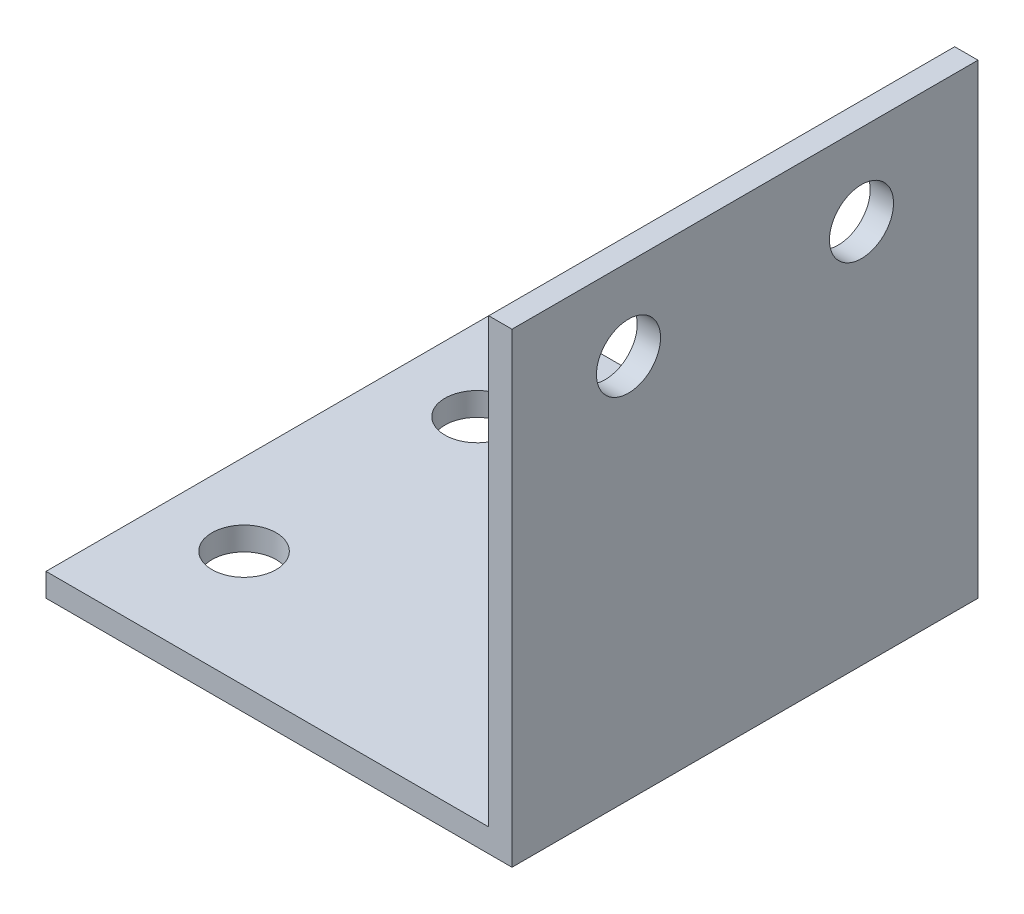
ISO-10303-21;
HEADER;
FILE_DESCRIPTION(('STEP AP214'),'2;1');
FILE_NAME('part.step','',(''),(''),'','','');
FILE_SCHEMA(('AUTOMOTIVE_DESIGN { 1 0 10303 214 1 1 1 1 }'));
ENDSEC;
DATA;
#1=APPLICATION_CONTEXT('core data for automotive mechanical design processes');
#2=APPLICATION_PROTOCOL_DEFINITION('international standard','automotive_design',2000,#1);
#3=PRODUCT_CONTEXT('',#1,'mechanical');
#4=PRODUCT('Part','Part','',(#3));
#5=PRODUCT_RELATED_PRODUCT_CATEGORY('part','',(#4));
#6=PRODUCT_DEFINITION_FORMATION('','',#4);
#7=PRODUCT_DEFINITION_CONTEXT('part definition',#1,'design');
#8=PRODUCT_DEFINITION('design','',#6,#7);
#9=PRODUCT_DEFINITION_SHAPE('','',#8);
#10=(LENGTH_UNIT() NAMED_UNIT(*) SI_UNIT(.MILLI.,.METRE.));
#11=(NAMED_UNIT(*) PLANE_ANGLE_UNIT() SI_UNIT($,.RADIAN.));
#12=(NAMED_UNIT(*) SI_UNIT($,.STERADIAN.) SOLID_ANGLE_UNIT());
#13=UNCERTAINTY_MEASURE_WITH_UNIT(LENGTH_MEASURE(1.E-05),#10,'distance_accuracy_value','');
#14=(GEOMETRIC_REPRESENTATION_CONTEXT(3) GLOBAL_UNCERTAINTY_ASSIGNED_CONTEXT((#13)) GLOBAL_UNIT_ASSIGNED_CONTEXT((#10,
#11,#12)) REPRESENTATION_CONTEXT('',''));
#15=CARTESIAN_POINT('',(0.,0.,0.));
#16=DIRECTION('',(0.,0.,1.));
#17=DIRECTION('',(1.,0.,0.));
#18=AXIS2_PLACEMENT_3D('',#15,#16,#17);
#19=CARTESIAN_POINT('',(38.,0.,40.));
#20=DIRECTION('',(0.,-1.,0.));
#21=DIRECTION('',(1.,0.,0.));
#22=AXIS2_PLACEMENT_3D('',#19,#20,#21);
#23=PLANE('',#22);
#24=CARTESIAN_POINT('',(7.00000000000002,0.,30.));
#25=DIRECTION('',(0.,-1.,0.));
#26=DIRECTION('',(1.,0.,0.));
#27=AXIS2_PLACEMENT_3D('',#24,#25,#26);
#28=CIRCLE('',#27,2.75);
#29=CARTESIAN_POINT('',(9.75000000000002,0.,30.));
#30=VERTEX_POINT('',#29);
#31=EDGE_CURVE('E148',#30,#30,#28,.F.);
#32=ORIENTED_EDGE('',*,*,#31,.F.);
#33=EDGE_LOOP('',(#32));
#34=FACE_BOUND('',#33,.T.);
#35=CARTESIAN_POINT('',(7.00000000000002,0.,10.));
#36=DIRECTION('',(0.,-1.,0.));
#37=DIRECTION('',(1.,0.,0.));
#38=AXIS2_PLACEMENT_3D('',#35,#36,#37);
#39=CIRCLE('',#38,2.75);
#40=CARTESIAN_POINT('',(9.75000000000002,0.,10.));
#41=VERTEX_POINT('',#40);
#42=EDGE_CURVE('E185',#41,#41,#39,.F.);
#43=ORIENTED_EDGE('',*,*,#42,.F.);
#44=EDGE_LOOP('',(#43));
#45=FACE_BOUND('',#44,.T.);
#46=DIRECTION('',(-1.,0.,0.));
#47=VECTOR('',#46,1.);
#48=CARTESIAN_POINT('',(38.,0.,0.));
#49=LINE('',#48,#47);
#50=CARTESIAN_POINT('',(38.,0.,0.));
#51=VERTEX_POINT('',#50);
#52=CARTESIAN_POINT('',(0.,0.,0.));
#53=VERTEX_POINT('',#52);
#54=EDGE_CURVE('E121',#51,#53,#49,.T.);
#55=ORIENTED_EDGE('',*,*,#54,.T.);
#56=DIRECTION('',(0.,0.,-1.));
#57=VECTOR('',#56,1.);
#58=CARTESIAN_POINT('',(0.,0.,40.));
#59=LINE('',#58,#57);
#60=CARTESIAN_POINT('',(0.,0.,40.));
#61=VERTEX_POINT('',#60);
#62=EDGE_CURVE('E11',#61,#53,#59,.T.);
#63=ORIENTED_EDGE('',*,*,#62,.F.);
#64=DIRECTION('',(-1.,0.,0.));
#65=VECTOR('',#64,1.);
#66=CARTESIAN_POINT('',(38.,0.,40.));
#67=LINE('',#66,#65);
#68=CARTESIAN_POINT('',(38.,0.,40.));
#69=VERTEX_POINT('',#68);
#70=EDGE_CURVE('E131',#69,#61,#67,.T.);
#71=ORIENTED_EDGE('',*,*,#70,.F.);
#72=DIRECTION('',(0.,0.,-1.));
#73=VECTOR('',#72,1.);
#74=CARTESIAN_POINT('',(38.,0.,40.));
#75=LINE('',#74,#73);
#76=EDGE_CURVE('E117',#69,#51,#75,.T.);
#77=ORIENTED_EDGE('',*,*,#76,.T.);
#78=EDGE_LOOP('',(#55,#63,#71,#77));
#79=FACE_BOUND('',#78,.T.);
#80=ADVANCED_FACE('F35',(#34,#45,#79),#23,.F.);
#81=CARTESIAN_POINT('',(0.,0.,40.));
#82=DIRECTION('',(1.,0.,0.));
#83=DIRECTION('',(0.,1.,0.));
#84=AXIS2_PLACEMENT_3D('',#81,#82,#83);
#85=PLANE('',#84);
#86=DIRECTION('',(0.,-1.,0.));
#87=VECTOR('',#86,1.);
#88=CARTESIAN_POINT('',(0.,0.,0.));
#89=LINE('',#88,#87);
#90=CARTESIAN_POINT('',(0.,-2.,0.));
#91=VERTEX_POINT('',#90);
#92=EDGE_CURVE('E124',#53,#91,#89,.T.);
#93=ORIENTED_EDGE('',*,*,#92,.T.);
#94=DIRECTION('',(0.,0.,-1.));
#95=VECTOR('',#94,1.);
#96=CARTESIAN_POINT('',(0.,-2.,40.));
#97=LINE('',#96,#95);
#98=CARTESIAN_POINT('',(0.,-2.,40.));
#99=VERTEX_POINT('',#98);
#100=EDGE_CURVE('E44',#99,#91,#97,.T.);
#101=ORIENTED_EDGE('',*,*,#100,.F.);
#102=DIRECTION('',(0.,-1.,0.));
#103=VECTOR('',#102,1.);
#104=CARTESIAN_POINT('',(0.,0.,40.));
#105=LINE('',#104,#103);
#106=EDGE_CURVE('E90',#61,#99,#105,.T.);
#107=ORIENTED_EDGE('',*,*,#106,.F.);
#108=ORIENTED_EDGE('',*,*,#62,.T.);
#109=EDGE_LOOP('',(#93,#101,#107,#108));
#110=FACE_BOUND('',#109,.T.);
#111=ADVANCED_FACE('F156',(#110),#85,.F.);
#112=CARTESIAN_POINT('',(0.,-2.,40.));
#113=DIRECTION('',(0.,1.,0.));
#114=DIRECTION('',(0.,0.,1.));
#115=AXIS2_PLACEMENT_3D('',#112,#113,#114);
#116=PLANE('',#115);
#117=CARTESIAN_POINT('',(7.00000000000002,-1.99999999999987,30.));
#118=DIRECTION('',(0.,1.,0.));
#119=DIRECTION('',(0.,0.,-1.));
#120=AXIS2_PLACEMENT_3D('',#117,#118,#119);
#121=CIRCLE('',#120,2.75);
#122=CARTESIAN_POINT('',(7.00000000000002,-1.99999999999987,27.25));
#123=VERTEX_POINT('',#122);
#124=EDGE_CURVE('E187',#123,#123,#121,.T.);
#125=ORIENTED_EDGE('',*,*,#124,.T.);
#126=EDGE_LOOP('',(#125));
#127=FACE_BOUND('',#126,.T.);
#128=CARTESIAN_POINT('',(7.00000000000001,-1.99999999999987,10.));
#129=DIRECTION('',(0.,1.,0.));
#130=DIRECTION('',(0.,0.,1.));
#131=AXIS2_PLACEMENT_3D('',#128,#129,#130);
#132=CIRCLE('',#131,2.75);
#133=CARTESIAN_POINT('',(7.00000000000001,-1.99999999999987,12.75));
#134=VERTEX_POINT('',#133);
#135=EDGE_CURVE('E189',#134,#134,#132,.T.);
#136=ORIENTED_EDGE('',*,*,#135,.T.);
#137=EDGE_LOOP('',(#136));
#138=FACE_BOUND('',#137,.T.);
#139=DIRECTION('',(1.,0.,0.));
#140=VECTOR('',#139,1.);
#141=CARTESIAN_POINT('',(0.,-2.,0.));
#142=LINE('',#141,#140);
#143=CARTESIAN_POINT('',(40.,-2.,0.));
#144=VERTEX_POINT('',#143);
#145=EDGE_CURVE('E126',#91,#144,#142,.T.);
#146=ORIENTED_EDGE('',*,*,#145,.T.);
#147=DIRECTION('',(0.,0.,-1.));
#148=VECTOR('',#147,1.);
#149=CARTESIAN_POINT('',(40.,-2.,40.));
#150=LINE('',#149,#148);
#151=CARTESIAN_POINT('',(40.,-2.,40.));
#152=VERTEX_POINT('',#151);
#153=EDGE_CURVE('E112',#152,#144,#150,.T.);
#154=ORIENTED_EDGE('',*,*,#153,.F.);
#155=DIRECTION('',(1.,0.,0.));
#156=VECTOR('',#155,1.);
#157=CARTESIAN_POINT('',(0.,-2.,40.));
#158=LINE('',#157,#156);
#159=EDGE_CURVE('E103',#99,#152,#158,.T.);
#160=ORIENTED_EDGE('',*,*,#159,.F.);
#161=ORIENTED_EDGE('',*,*,#100,.T.);
#162=EDGE_LOOP('',(#146,#154,#160,#161));
#163=FACE_BOUND('',#162,.T.);
#164=ADVANCED_FACE('F159',(#127,#138,#163),#116,.F.);
#165=CARTESIAN_POINT('',(40.,-2.,40.));
#166=DIRECTION('',(-1.,0.,0.));
#167=DIRECTION('',(0.,0.,1.));
#168=AXIS2_PLACEMENT_3D('',#165,#166,#167);
#169=PLANE('',#168);
#170=CARTESIAN_POINT('',(40.,31.,30.));
#171=DIRECTION('',(1.,0.,0.));
#172=DIRECTION('',(0.,0.,-1.));
#173=AXIS2_PLACEMENT_3D('',#170,#171,#172);
#174=CIRCLE('',#173,2.75);
#175=CARTESIAN_POINT('',(40.,31.,27.25));
#176=VERTEX_POINT('',#175);
#177=EDGE_CURVE('E138',#176,#176,#174,.T.);
#178=ORIENTED_EDGE('',*,*,#177,.F.);
#179=EDGE_LOOP('',(#178));
#180=FACE_BOUND('',#179,.T.);
#181=CARTESIAN_POINT('',(40.,31.,10.));
#182=DIRECTION('',(1.,0.,0.));
#183=DIRECTION('',(0.,0.,1.));
#184=AXIS2_PLACEMENT_3D('',#181,#182,#183);
#185=CIRCLE('',#184,2.75);
#186=CARTESIAN_POINT('',(40.,31.,12.75));
#187=VERTEX_POINT('',#186);
#188=EDGE_CURVE('E143',#187,#187,#185,.T.);
#189=ORIENTED_EDGE('',*,*,#188,.F.);
#190=EDGE_LOOP('',(#189));
#191=FACE_BOUND('',#190,.T.);
#192=DIRECTION('',(0.,1.,0.));
#193=VECTOR('',#192,1.);
#194=CARTESIAN_POINT('',(40.,-2.,0.));
#195=LINE('',#194,#193);
#196=CARTESIAN_POINT('',(40.,38.,0.));
#197=VERTEX_POINT('',#196);
#198=EDGE_CURVE('E111',#144,#197,#195,.T.);
#199=ORIENTED_EDGE('',*,*,#198,.T.);
#200=DIRECTION('',(0.,0.,-1.));
#201=VECTOR('',#200,1.);
#202=CARTESIAN_POINT('',(40.,38.,40.));
#203=LINE('',#202,#201);
#204=CARTESIAN_POINT('',(40.,38.,40.));
#205=VERTEX_POINT('',#204);
#206=EDGE_CURVE('E108',#205,#197,#203,.T.);
#207=ORIENTED_EDGE('',*,*,#206,.F.);
#208=DIRECTION('',(0.,1.,0.));
#209=VECTOR('',#208,1.);
#210=CARTESIAN_POINT('',(40.,-2.,40.));
#211=LINE('',#210,#209);
#212=EDGE_CURVE('E97',#152,#205,#211,.T.);
#213=ORIENTED_EDGE('',*,*,#212,.F.);
#214=ORIENTED_EDGE('',*,*,#153,.T.);
#215=EDGE_LOOP('',(#199,#207,#213,#214));
#216=FACE_BOUND('',#215,.T.);
#217=ADVANCED_FACE('F109',(#180,#191,#216),#169,.F.);
#218=CARTESIAN_POINT('',(40.,38.,40.));
#219=DIRECTION('',(0.,-1.,0.));
#220=DIRECTION('',(0.,0.,-1.));
#221=AXIS2_PLACEMENT_3D('',#218,#219,#220);
#222=PLANE('',#221);
#223=DIRECTION('',(-1.,0.,0.));
#224=VECTOR('',#223,1.);
#225=CARTESIAN_POINT('',(40.,38.,0.));
#226=LINE('',#225,#224);
#227=CARTESIAN_POINT('',(38.,38.,0.));
#228=VERTEX_POINT('',#227);
#229=EDGE_CURVE('E76',#197,#228,#226,.T.);
#230=ORIENTED_EDGE('',*,*,#229,.T.);
#231=DIRECTION('',(0.,0.,-1.));
#232=VECTOR('',#231,1.);
#233=CARTESIAN_POINT('',(38.,38.,40.));
#234=LINE('',#233,#232);
#235=CARTESIAN_POINT('',(38.,38.,40.));
#236=VERTEX_POINT('',#235);
#237=EDGE_CURVE('E113',#236,#228,#234,.T.);
#238=ORIENTED_EDGE('',*,*,#237,.F.);
#239=DIRECTION('',(-1.,0.,0.));
#240=VECTOR('',#239,1.);
#241=CARTESIAN_POINT('',(40.,38.,40.));
#242=LINE('',#241,#240);
#243=EDGE_CURVE('E101',#205,#236,#242,.T.);
#244=ORIENTED_EDGE('',*,*,#243,.F.);
#245=ORIENTED_EDGE('',*,*,#206,.T.);
#246=EDGE_LOOP('',(#230,#238,#244,#245));
#247=FACE_BOUND('',#246,.T.);
#248=ADVANCED_FACE('F115',(#247),#222,.F.);
#249=CARTESIAN_POINT('',(38.,38.,40.));
#250=DIRECTION('',(1.,0.,0.));
#251=DIRECTION('',(0.,1.,0.));
#252=AXIS2_PLACEMENT_3D('',#249,#250,#251);
#253=PLANE('',#252);
#254=CARTESIAN_POINT('',(38.,31.,30.));
#255=DIRECTION('',(1.,0.,0.));
#256=DIRECTION('',(0.,1.,0.));
#257=AXIS2_PLACEMENT_3D('',#254,#255,#256);
#258=CIRCLE('',#257,2.75);
#259=CARTESIAN_POINT('',(38.,33.75,30.));
#260=VERTEX_POINT('',#259);
#261=EDGE_CURVE('E38',#260,#260,#258,.T.);
#262=ORIENTED_EDGE('',*,*,#261,.T.);
#263=EDGE_LOOP('',(#262));
#264=FACE_BOUND('',#263,.T.);
#265=CARTESIAN_POINT('',(38.,31.,10.));
#266=DIRECTION('',(1.,0.,0.));
#267=DIRECTION('',(0.,1.,0.));
#268=AXIS2_PLACEMENT_3D('',#265,#266,#267);
#269=CIRCLE('',#268,2.75);
#270=CARTESIAN_POINT('',(38.,33.75,10.));
#271=VERTEX_POINT('',#270);
#272=EDGE_CURVE('E136',#271,#271,#269,.T.);
#273=ORIENTED_EDGE('',*,*,#272,.T.);
#274=EDGE_LOOP('',(#273));
#275=FACE_BOUND('',#274,.T.);
#276=DIRECTION('',(0.,-1.,0.));
#277=VECTOR('',#276,1.);
#278=CARTESIAN_POINT('',(38.,38.,0.));
#279=LINE('',#278,#277);
#280=EDGE_CURVE('E82',#228,#51,#279,.T.);
#281=ORIENTED_EDGE('',*,*,#280,.T.);
#282=ORIENTED_EDGE('',*,*,#76,.F.);
#283=DIRECTION('',(0.,-1.,0.));
#284=VECTOR('',#283,1.);
#285=CARTESIAN_POINT('',(38.,38.,40.));
#286=LINE('',#285,#284);
#287=EDGE_CURVE('E53',#236,#69,#286,.T.);
#288=ORIENTED_EDGE('',*,*,#287,.F.);
#289=ORIENTED_EDGE('',*,*,#237,.T.);
#290=EDGE_LOOP('',(#281,#282,#288,#289));
#291=FACE_BOUND('',#290,.T.);
#292=ADVANCED_FACE('F164',(#264,#275,#291),#253,.F.);
#293=CARTESIAN_POINT('',(0.,0.,40.));
#294=DIRECTION('',(0.,0.,1.));
#295=DIRECTION('',(1.,0.,0.));
#296=AXIS2_PLACEMENT_3D('',#293,#294,#295);
#297=PLANE('',#296);
#298=ORIENTED_EDGE('',*,*,#70,.T.);
#299=ORIENTED_EDGE('',*,*,#106,.T.);
#300=ORIENTED_EDGE('',*,*,#159,.T.);
#301=ORIENTED_EDGE('',*,*,#212,.T.);
#302=ORIENTED_EDGE('',*,*,#243,.T.);
#303=ORIENTED_EDGE('',*,*,#287,.T.);
#304=EDGE_LOOP('',(#298,#299,#300,#301,#302,#303));
#305=FACE_BOUND('',#304,.T.);
#306=ADVANCED_FACE('F99',(#305),#297,.T.);
#307=CARTESIAN_POINT('',(0.,0.,0.));
#308=DIRECTION('',(0.,0.,1.));
#309=DIRECTION('',(1.,0.,0.));
#310=AXIS2_PLACEMENT_3D('',#307,#308,#309);
#311=PLANE('',#310);
#312=ORIENTED_EDGE('',*,*,#54,.F.);
#313=ORIENTED_EDGE('',*,*,#280,.F.);
#314=ORIENTED_EDGE('',*,*,#229,.F.);
#315=ORIENTED_EDGE('',*,*,#198,.F.);
#316=ORIENTED_EDGE('',*,*,#145,.F.);
#317=ORIENTED_EDGE('',*,*,#92,.F.);
#318=EDGE_LOOP('',(#312,#313,#314,#315,#316,#317));
#319=FACE_BOUND('',#318,.T.);
#320=ADVANCED_FACE('F162',(#319),#311,.F.);
#321=CARTESIAN_POINT('',(0.,31.,10.));
#322=DIRECTION('',(1.,0.,0.));
#323=DIRECTION('',(0.,0.,-1.));
#324=AXIS2_PLACEMENT_3D('',#321,#322,#323);
#325=CYLINDRICAL_SURFACE('',#324,2.75);
#326=ORIENTED_EDGE('',*,*,#188,.T.);
#327=EDGE_LOOP('',(#326));
#328=FACE_BOUND('',#327,.T.);
#329=ORIENTED_EDGE('',*,*,#272,.F.);
#330=EDGE_LOOP('',(#329));
#331=FACE_BOUND('',#330,.T.);
#332=ADVANCED_FACE('F207',(#328,#331),#325,.F.);
#333=CARTESIAN_POINT('',(0.,31.,30.));
#334=DIRECTION('',(1.,0.,0.));
#335=DIRECTION('',(0.,0.,-1.));
#336=AXIS2_PLACEMENT_3D('',#333,#334,#335);
#337=CYLINDRICAL_SURFACE('',#336,2.75);
#338=ORIENTED_EDGE('',*,*,#177,.T.);
#339=EDGE_LOOP('',(#338));
#340=FACE_BOUND('',#339,.T.);
#341=ORIENTED_EDGE('',*,*,#261,.F.);
#342=EDGE_LOOP('',(#341));
#343=FACE_BOUND('',#342,.T.);
#344=ADVANCED_FACE('F199',(#340,#343),#337,.F.);
#345=CARTESIAN_POINT('',(7.00000000000016,38.0000000000001,10.));
#346=DIRECTION('',(0.,-1.,0.));
#347=DIRECTION('',(1.,0.,0.));
#348=AXIS2_PLACEMENT_3D('',#345,#346,#347);
#349=CYLINDRICAL_SURFACE('',#348,2.75);
#350=ORIENTED_EDGE('',*,*,#135,.F.);
#351=EDGE_LOOP('',(#350));
#352=FACE_BOUND('',#351,.T.);
#353=ORIENTED_EDGE('',*,*,#42,.T.);
#354=EDGE_LOOP('',(#353));
#355=FACE_BOUND('',#354,.T.);
#356=ADVANCED_FACE('F196',(#352,#355),#349,.F.);
#357=CARTESIAN_POINT('',(7.00000000000016,38.0000000000001,30.));
#358=DIRECTION('',(0.,-1.,0.));
#359=DIRECTION('',(1.,0.,0.));
#360=AXIS2_PLACEMENT_3D('',#357,#358,#359);
#361=CYLINDRICAL_SURFACE('',#360,2.75);
#362=ORIENTED_EDGE('',*,*,#124,.F.);
#363=EDGE_LOOP('',(#362));
#364=FACE_BOUND('',#363,.T.);
#365=ORIENTED_EDGE('',*,*,#31,.T.);
#366=EDGE_LOOP('',(#365));
#367=FACE_BOUND('',#366,.T.);
#368=ADVANCED_FACE('F198',(#364,#367),#361,.F.);
#369=CLOSED_SHELL('',(#80,#111,#164,#217,#248,#292,#306,#320,#332,#344,#356,#368));
#370=MANIFOLD_SOLID_BREP('B2',#369);
#371=ADVANCED_BREP_SHAPE_REPRESENTATION('',(#18,#370),#14);
#372=SHAPE_DEFINITION_REPRESENTATION(#9,#371);
ENDSEC;
END-ISO-10303-21;
